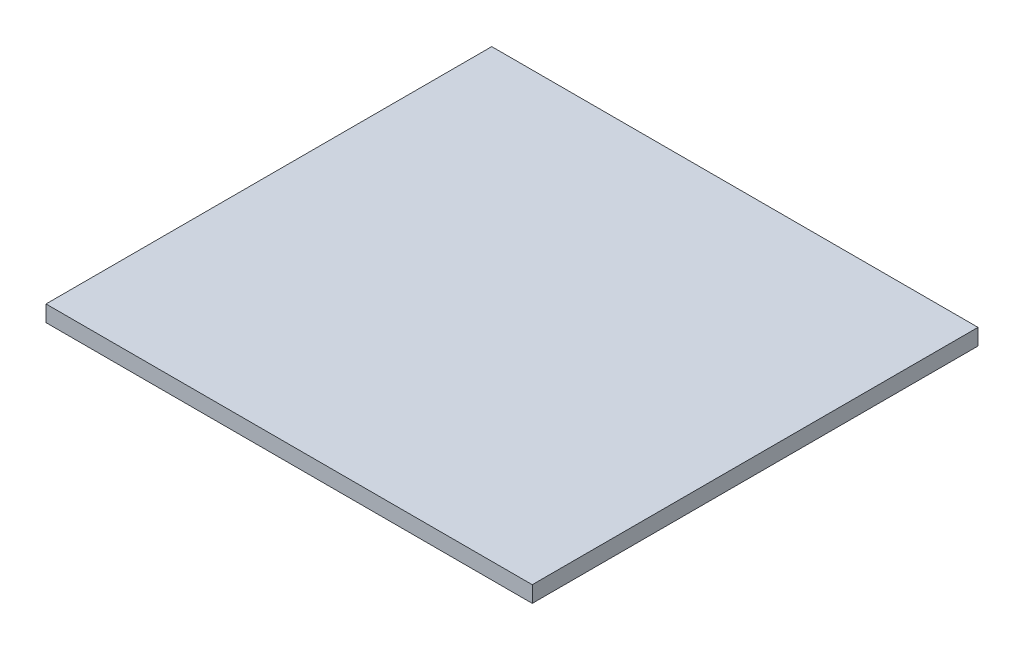
ISO-10303-21;
HEADER;
FILE_DESCRIPTION(('STEP AP214'),'2;1');
FILE_NAME('part.step','',(''),(''),'','','');
FILE_SCHEMA(('AUTOMOTIVE_DESIGN { 1 0 10303 214 1 1 1 1 }'));
ENDSEC;
DATA;
#1=APPLICATION_CONTEXT('core data for automotive mechanical design processes');
#2=APPLICATION_PROTOCOL_DEFINITION('international standard','automotive_design',2000,#1);
#3=PRODUCT_CONTEXT('',#1,'mechanical');
#4=PRODUCT('Part','Part','',(#3));
#5=PRODUCT_RELATED_PRODUCT_CATEGORY('part','',(#4));
#6=PRODUCT_DEFINITION_FORMATION('','',#4);
#7=PRODUCT_DEFINITION_CONTEXT('part definition',#1,'design');
#8=PRODUCT_DEFINITION('design','',#6,#7);
#9=PRODUCT_DEFINITION_SHAPE('','',#8);
#10=(LENGTH_UNIT() NAMED_UNIT(*) SI_UNIT(.MILLI.,.METRE.));
#11=(NAMED_UNIT(*) PLANE_ANGLE_UNIT() SI_UNIT($,.RADIAN.));
#12=(NAMED_UNIT(*) SI_UNIT($,.STERADIAN.) SOLID_ANGLE_UNIT());
#13=UNCERTAINTY_MEASURE_WITH_UNIT(LENGTH_MEASURE(1.E-05),#10,'distance_accuracy_value','');
#14=(GEOMETRIC_REPRESENTATION_CONTEXT(3) GLOBAL_UNCERTAINTY_ASSIGNED_CONTEXT((#13)) GLOBAL_UNIT_ASSIGNED_CONTEXT((#10,
#11,#12)) REPRESENTATION_CONTEXT('',''));
#15=CARTESIAN_POINT('',(0.,0.,0.));
#16=DIRECTION('',(0.,0.,1.));
#17=DIRECTION('',(1.,0.,0.));
#18=AXIS2_PLACEMENT_3D('',#15,#16,#17);
#19=CARTESIAN_POINT('',(600.,40.,550.));
#20=DIRECTION('',(-1.,0.,0.));
#21=DIRECTION('',(0.,0.,1.));
#22=AXIS2_PLACEMENT_3D('',#19,#20,#21);
#23=PLANE('',#22);
#24=DIRECTION('',(0.,0.,-1.));
#25=VECTOR('',#24,1.);
#26=CARTESIAN_POINT('',(600.,0.,550.));
#27=LINE('',#26,#25);
#28=CARTESIAN_POINT('',(600.,0.,550.));
#29=VERTEX_POINT('',#28);
#30=CARTESIAN_POINT('',(600.,0.,-550.));
#31=VERTEX_POINT('',#30);
#32=EDGE_CURVE('E106',#29,#31,#27,.T.);
#33=ORIENTED_EDGE('',*,*,#32,.T.);
#34=DIRECTION('',(0.,-1.,0.));
#35=VECTOR('',#34,1.);
#36=CARTESIAN_POINT('',(600.,40.,-550.));
#37=LINE('',#36,#35);
#38=CARTESIAN_POINT('',(600.,40.,-550.));
#39=VERTEX_POINT('',#38);
#40=EDGE_CURVE('E11',#39,#31,#37,.T.);
#41=ORIENTED_EDGE('',*,*,#40,.F.);
#42=DIRECTION('',(0.,0.,-1.));
#43=VECTOR('',#42,1.);
#44=CARTESIAN_POINT('',(600.,40.,550.));
#45=LINE('',#44,#43);
#46=CARTESIAN_POINT('',(600.,40.,550.));
#47=VERTEX_POINT('',#46);
#48=EDGE_CURVE('E90',#47,#39,#45,.T.);
#49=ORIENTED_EDGE('',*,*,#48,.F.);
#50=DIRECTION('',(0.,-1.,0.));
#51=VECTOR('',#50,1.);
#52=CARTESIAN_POINT('',(600.,40.,550.));
#53=LINE('',#52,#51);
#54=EDGE_CURVE('E102',#47,#29,#53,.T.);
#55=ORIENTED_EDGE('',*,*,#54,.T.);
#56=EDGE_LOOP('',(#33,#41,#49,#55));
#57=FACE_BOUND('',#56,.T.);
#58=ADVANCED_FACE('F38',(#57),#23,.F.);
#59=CARTESIAN_POINT('',(-600.,40.,-550.));
#60=DIRECTION('',(0.,0.,1.));
#61=DIRECTION('',(1.,0.,0.));
#62=AXIS2_PLACEMENT_3D('',#59,#60,#61);
#63=PLANE('',#62);
#64=DIRECTION('',(-1.,0.,0.));
#65=VECTOR('',#64,1.);
#66=CARTESIAN_POINT('',(-600.,0.,-550.));
#67=LINE('',#66,#65);
#68=CARTESIAN_POINT('',(-600.,0.,-550.));
#69=VERTEX_POINT('',#68);
#70=EDGE_CURVE('E95',#31,#69,#67,.T.);
#71=ORIENTED_EDGE('',*,*,#70,.T.);
#72=DIRECTION('',(0.,-1.,0.));
#73=VECTOR('',#72,1.);
#74=CARTESIAN_POINT('',(-600.,40.,-550.));
#75=LINE('',#74,#73);
#76=CARTESIAN_POINT('',(-600.,40.,-550.));
#77=VERTEX_POINT('',#76);
#78=EDGE_CURVE('E47',#77,#69,#75,.T.);
#79=ORIENTED_EDGE('',*,*,#78,.F.);
#80=DIRECTION('',(-1.,0.,0.));
#81=VECTOR('',#80,1.);
#82=CARTESIAN_POINT('',(-600.,40.,-550.));
#83=LINE('',#82,#81);
#84=EDGE_CURVE('E85',#39,#77,#83,.T.);
#85=ORIENTED_EDGE('',*,*,#84,.F.);
#86=ORIENTED_EDGE('',*,*,#40,.T.);
#87=EDGE_LOOP('',(#71,#79,#85,#86));
#88=FACE_BOUND('',#87,.T.);
#89=ADVANCED_FACE('F94',(#88),#63,.F.);
#90=CARTESIAN_POINT('',(-600.,40.,550.));
#91=DIRECTION('',(1.,0.,0.));
#92=DIRECTION('',(0.,0.,-1.));
#93=AXIS2_PLACEMENT_3D('',#90,#91,#92);
#94=PLANE('',#93);
#95=DIRECTION('',(0.,0.,1.));
#96=VECTOR('',#95,1.);
#97=CARTESIAN_POINT('',(-600.,0.,550.));
#98=LINE('',#97,#96);
#99=CARTESIAN_POINT('',(-600.,0.,550.));
#100=VERTEX_POINT('',#99);
#101=EDGE_CURVE('E72',#69,#100,#98,.T.);
#102=ORIENTED_EDGE('',*,*,#101,.T.);
#103=DIRECTION('',(0.,-1.,0.));
#104=VECTOR('',#103,1.);
#105=CARTESIAN_POINT('',(-600.,40.,550.));
#106=LINE('',#105,#104);
#107=CARTESIAN_POINT('',(-600.,40.,550.));
#108=VERTEX_POINT('',#107);
#109=EDGE_CURVE('E97',#108,#100,#106,.T.);
#110=ORIENTED_EDGE('',*,*,#109,.F.);
#111=DIRECTION('',(0.,0.,1.));
#112=VECTOR('',#111,1.);
#113=CARTESIAN_POINT('',(-600.,40.,550.));
#114=LINE('',#113,#112);
#115=EDGE_CURVE('E88',#77,#108,#114,.T.);
#116=ORIENTED_EDGE('',*,*,#115,.F.);
#117=ORIENTED_EDGE('',*,*,#78,.T.);
#118=EDGE_LOOP('',(#102,#110,#116,#117));
#119=FACE_BOUND('',#118,.T.);
#120=ADVANCED_FACE('F98',(#119),#94,.F.);
#121=CARTESIAN_POINT('',(-600.,40.,550.));
#122=DIRECTION('',(0.,0.,-1.));
#123=DIRECTION('',(-1.,0.,0.));
#124=AXIS2_PLACEMENT_3D('',#121,#122,#123);
#125=PLANE('',#124);
#126=DIRECTION('',(1.,0.,0.));
#127=VECTOR('',#126,1.);
#128=CARTESIAN_POINT('',(-600.,0.,550.));
#129=LINE('',#128,#127);
#130=EDGE_CURVE('E78',#100,#29,#129,.T.);
#131=ORIENTED_EDGE('',*,*,#130,.T.);
#132=ORIENTED_EDGE('',*,*,#54,.F.);
#133=DIRECTION('',(1.,0.,0.));
#134=VECTOR('',#133,1.);
#135=CARTESIAN_POINT('',(-600.,40.,550.));
#136=LINE('',#135,#134);
#137=EDGE_CURVE('E55',#108,#47,#136,.T.);
#138=ORIENTED_EDGE('',*,*,#137,.F.);
#139=ORIENTED_EDGE('',*,*,#109,.T.);
#140=EDGE_LOOP('',(#131,#132,#138,#139));
#141=FACE_BOUND('',#140,.T.);
#142=ADVANCED_FACE('F119',(#141),#125,.F.);
#143=CARTESIAN_POINT('',(0.,40.,0.));
#144=DIRECTION('',(0.,-1.,0.));
#145=DIRECTION('',(0.,0.,-1.));
#146=AXIS2_PLACEMENT_3D('',#143,#144,#145);
#147=PLANE('',#146);
#148=ORIENTED_EDGE('',*,*,#48,.T.);
#149=ORIENTED_EDGE('',*,*,#84,.T.);
#150=ORIENTED_EDGE('',*,*,#115,.T.);
#151=ORIENTED_EDGE('',*,*,#137,.T.);
#152=EDGE_LOOP('',(#148,#149,#150,#151));
#153=FACE_BOUND('',#152,.T.);
#154=ADVANCED_FACE('F86',(#153),#147,.F.);
#155=CARTESIAN_POINT('',(0.,0.,0.));
#156=DIRECTION('',(0.,-1.,0.));
#157=DIRECTION('',(0.,0.,-1.));
#158=AXIS2_PLACEMENT_3D('',#155,#156,#157);
#159=PLANE('',#158);
#160=ORIENTED_EDGE('',*,*,#32,.F.);
#161=ORIENTED_EDGE('',*,*,#130,.F.);
#162=ORIENTED_EDGE('',*,*,#101,.F.);
#163=ORIENTED_EDGE('',*,*,#70,.F.);
#164=EDGE_LOOP('',(#160,#161,#162,#163));
#165=FACE_BOUND('',#164,.T.);
#166=ADVANCED_FACE('F122',(#165),#159,.T.);
#167=CLOSED_SHELL('',(#58,#89,#120,#142,#154,#166));
#168=MANIFOLD_SOLID_BREP('B2',#167);
#169=ADVANCED_BREP_SHAPE_REPRESENTATION('',(#18,#168),#14);
#170=SHAPE_DEFINITION_REPRESENTATION(#9,#169);
ENDSEC;
END-ISO-10303-21;
